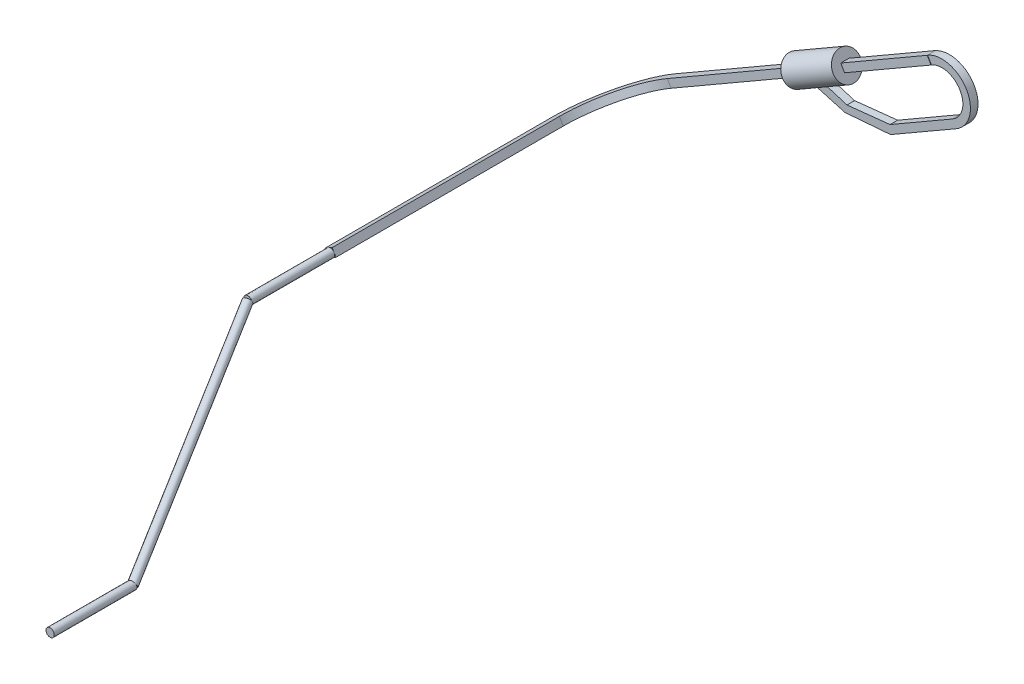
ISO-10303-21;
HEADER;
FILE_DESCRIPTION(('STEP AP214'),'2;1');
FILE_NAME('part.step','',(''),(''),'','','');
FILE_SCHEMA(('AUTOMOTIVE_DESIGN { 1 0 10303 214 1 1 1 1 }'));
ENDSEC;
DATA;
#1=APPLICATION_CONTEXT('core data for automotive mechanical design processes');
#2=APPLICATION_PROTOCOL_DEFINITION('international standard','automotive_design',2000,#1);
#3=PRODUCT_CONTEXT('',#1,'mechanical');
#4=PRODUCT('Part','Part','',(#3));
#5=PRODUCT_RELATED_PRODUCT_CATEGORY('part','',(#4));
#6=PRODUCT_DEFINITION_FORMATION('','',#4);
#7=PRODUCT_DEFINITION_CONTEXT('part definition',#1,'design');
#8=PRODUCT_DEFINITION('design','',#6,#7);
#9=PRODUCT_DEFINITION_SHAPE('','',#8);
#10=(LENGTH_UNIT() NAMED_UNIT(*) SI_UNIT(.MILLI.,.METRE.));
#11=(NAMED_UNIT(*) PLANE_ANGLE_UNIT() SI_UNIT($,.RADIAN.));
#12=(NAMED_UNIT(*) SI_UNIT($,.STERADIAN.) SOLID_ANGLE_UNIT());
#13=UNCERTAINTY_MEASURE_WITH_UNIT(LENGTH_MEASURE(1.E-05),#10,'distance_accuracy_value','');
#14=(GEOMETRIC_REPRESENTATION_CONTEXT(3) GLOBAL_UNCERTAINTY_ASSIGNED_CONTEXT((#13)) GLOBAL_UNIT_ASSIGNED_CONTEXT((#10,
#11,#12)) REPRESENTATION_CONTEXT('',''));
#15=CARTESIAN_POINT('',(0.,0.,0.));
#16=DIRECTION('',(0.,0.,1.));
#17=DIRECTION('',(1.,0.,0.));
#18=AXIS2_PLACEMENT_3D('',#15,#16,#17);
#19=CARTESIAN_POINT('',(8.06922863405995,34.0236860279186,-45.));
#20=DIRECTION('',(0.5,-0.866025403784439,0.));
#21=DIRECTION('',(0.866025403784439,0.5,0.));
#22=AXIS2_PLACEMENT_3D('',#19,#20,#21);
#23=PLANE('',#22);
#24=DIRECTION('',(0.866025403784439,0.5,0.));
#25=VECTOR('',#24,1.);
#26=CARTESIAN_POINT('',(8.06922863405995,34.0236860279186,-54.6));
#27=LINE('',#26,#25);
#28=CARTESIAN_POINT('',(8.06922863405995,34.0236860279186,-54.6));
#29=VERTEX_POINT('',#28);
#30=CARTESIAN_POINT('',(25.9080534025949,44.3229363100588,-54.6));
#31=VERTEX_POINT('',#30);
#32=EDGE_CURVE('E345',#29,#31,#27,.T.);
#33=ORIENTED_EDGE('',*,*,#32,.T.);
#34=DIRECTION('',(0.,0.,1.));
#35=VECTOR('',#34,1.);
#36=CARTESIAN_POINT('',(25.9080534025949,44.3229363100588,-45.));
#37=LINE('',#36,#35);
#38=CARTESIAN_POINT('',(25.9080534025949,44.3229363100588,-53.4));
#39=VERTEX_POINT('',#38);
#40=EDGE_CURVE('E63',#31,#39,#37,.T.);
#41=ORIENTED_EDGE('',*,*,#40,.T.);
#42=DIRECTION('',(-0.866025403784439,-0.5,0.));
#43=VECTOR('',#42,1.);
#44=CARTESIAN_POINT('',(45.826637689637,55.8229363100588,-53.4));
#45=LINE('',#44,#43);
#46=CARTESIAN_POINT('',(8.06922863405995,34.0236860279186,-53.4));
#47=VERTEX_POINT('',#46);
#48=EDGE_CURVE('E340',#39,#47,#45,.T.);
#49=ORIENTED_EDGE('',*,*,#48,.T.);
#50=CARTESIAN_POINT('',(8.06922863405995,34.0236860279186,-45.));
#51=DIRECTION('',(-0.5,0.866025403784439,0.));
#52=DIRECTION('',(-0.866025403784439,-0.5,0.));
#53=AXIS2_PLACEMENT_3D('',#50,#51,#52);
#54=CIRCLE('',#53,8.4);
#55=CARTESIAN_POINT('',(0.794615242270666,29.8236860279186,-45.));
#56=VERTEX_POINT('',#55);
#57=EDGE_CURVE('E335',#47,#56,#54,.T.);
#58=ORIENTED_EDGE('',*,*,#57,.T.);
#59=DIRECTION('',(0.,0.,1.));
#60=VECTOR('',#59,1.);
#61=CARTESIAN_POINT('',(0.794615242270663,29.8236860279186,-45.));
#62=LINE('',#61,#60);
#63=CARTESIAN_POINT('',(0.794615242270663,29.8236860279186,-12.));
#64=VERTEX_POINT('',#63);
#65=EDGE_CURVE('E329',#56,#64,#62,.T.);
#66=ORIENTED_EDGE('',*,*,#65,.T.);
#67=DIRECTION('',(-0.866025403784438,-0.500000000000001,0.));
#68=VECTOR('',#67,1.);
#69=CARTESIAN_POINT('',(0.794615242270663,29.8236860279186,-12.));
#70=LINE('',#69,#68);
#71=CARTESIAN_POINT('',(0.482665596572965,29.6435818160014,-12.));
#72=VERTEX_POINT('',#71);
#73=EDGE_CURVE('E349',#64,#72,#70,.T.);
#74=ORIENTED_EDGE('',*,*,#73,.T.);
#75=CARTESIAN_POINT('',(0.0673344034270324,29.4037902398357,-12.));
#76=VERTEX_POINT('',#75);
#77=EDGE_CURVE('E250',#72,#76,#70,.T.);
#78=ORIENTED_EDGE('',*,*,#77,.T.);
#79=CARTESIAN_POINT('',(-0.244615242270661,29.2236860279186,-12.));
#80=VERTEX_POINT('',#79);
#81=EDGE_CURVE('E313',#76,#80,#70,.T.);
#82=ORIENTED_EDGE('',*,*,#81,.T.);
#83=DIRECTION('',(0.,0.,-1.));
#84=VECTOR('',#83,1.);
#85=CARTESIAN_POINT('',(-0.244615242270661,29.2236860279186,-12.));
#86=LINE('',#85,#84);
#87=CARTESIAN_POINT('',(-0.244615242270661,29.2236860279186,-45.));
#88=VERTEX_POINT('',#87);
#89=EDGE_CURVE('E350',#80,#88,#86,.T.);
#90=ORIENTED_EDGE('',*,*,#89,.T.);
#91=CARTESIAN_POINT('',(8.06922863405995,34.0236860279186,-45.));
#92=DIRECTION('',(0.5,-0.866025403784439,0.));
#93=DIRECTION('',(0.866025403784439,0.5,0.));
#94=AXIS2_PLACEMENT_3D('',#91,#92,#93);
#95=CIRCLE('',#94,9.6);
#96=EDGE_CURVE('E344',#88,#29,#95,.T.);
#97=ORIENTED_EDGE('',*,*,#96,.T.);
#98=EDGE_LOOP('',(#33,#41,#49,#58,#66,#74,#78,#82,#90,#97));
#99=FACE_BOUND('',#98,.T.);
#100=ADVANCED_FACE('F39',(#99),#23,.T.);
#101=CARTESIAN_POINT('',(8.06922863405995,34.0236860279186,-54.6));
#102=DIRECTION('',(0.,0.,1.));
#103=DIRECTION('',(1.,0.,0.));
#104=AXIS2_PLACEMENT_3D('',#101,#102,#103);
#105=PLANE('',#104);
#106=DIRECTION('',(-0.5,0.866025403784439,0.));
#107=VECTOR('',#106,1.);
#108=CARTESIAN_POINT('',(25.9080534025949,44.3229363100588,-54.6));
#109=LINE('',#108,#107);
#110=CARTESIAN_POINT('',(25.3580534025949,45.2755642542217,-54.6));
#111=VERTEX_POINT('',#110);
#112=EDGE_CURVE('E53',#31,#111,#109,.T.);
#113=ORIENTED_EDGE('',*,*,#112,.F.);
#114=ORIENTED_EDGE('',*,*,#32,.F.);
#115=DIRECTION('',(-0.5,0.866025403784438,0.));
#116=VECTOR('',#115,1.);
#117=CARTESIAN_POINT('',(8.06922863405995,34.0236860279186,-54.6));
#118=LINE('',#117,#116);
#119=CARTESIAN_POINT('',(7.51922863405995,34.9763139720814,-54.6));
#120=VERTEX_POINT('',#119);
#121=EDGE_CURVE('E287',#29,#120,#118,.T.);
#122=ORIENTED_EDGE('',*,*,#121,.T.);
#123=DIRECTION('',(0.866025403784439,0.5,0.));
#124=VECTOR('',#123,1.);
#125=CARTESIAN_POINT('',(7.51922863405995,34.9763139720814,-54.6));
#126=LINE('',#125,#124);
#127=EDGE_CURVE('E325',#120,#111,#126,.T.);
#128=ORIENTED_EDGE('',*,*,#127,.T.);
#129=EDGE_LOOP('',(#113,#114,#122,#128));
#130=FACE_BOUND('',#129,.T.);
#131=ADVANCED_FACE('F457',(#130),#105,.F.);
#132=CARTESIAN_POINT('',(45.826637689637,55.8229363100588,-53.4));
#133=DIRECTION('',(0.,0.,-1.));
#134=DIRECTION('',(-1.,0.,0.));
#135=AXIS2_PLACEMENT_3D('',#132,#133,#134);
#136=PLANE('',#135);
#137=DIRECTION('',(0.5,-0.866025403784439,0.));
#138=VECTOR('',#137,1.);
#139=CARTESIAN_POINT('',(25.9080534025949,44.3229363100588,-53.4));
#140=LINE('',#139,#138);
#141=CARTESIAN_POINT('',(25.3580534025949,45.2755642542217,-53.4));
#142=VERTEX_POINT('',#141);
#143=EDGE_CURVE('E420',#142,#39,#140,.T.);
#144=ORIENTED_EDGE('',*,*,#143,.F.);
#145=DIRECTION('',(-0.866025403784439,-0.5,0.));
#146=VECTOR('',#145,1.);
#147=CARTESIAN_POINT('',(45.276637689637,56.7755642542217,-53.4));
#148=LINE('',#147,#146);
#149=CARTESIAN_POINT('',(7.51922863405995,34.9763139720814,-53.4));
#150=VERTEX_POINT('',#149);
#151=EDGE_CURVE('E320',#142,#150,#148,.T.);
#152=ORIENTED_EDGE('',*,*,#151,.T.);
#153=DIRECTION('',(-0.5,0.866025403784438,0.));
#154=VECTOR('',#153,1.);
#155=CARTESIAN_POINT('',(8.06922863405995,34.0236860279186,-53.4));
#156=LINE('',#155,#154);
#157=EDGE_CURVE('E296',#47,#150,#156,.T.);
#158=ORIENTED_EDGE('',*,*,#157,.F.);
#159=ORIENTED_EDGE('',*,*,#48,.F.);
#160=EDGE_LOOP('',(#144,#152,#158,#159));
#161=FACE_BOUND('',#160,.T.);
#162=ADVANCED_FACE('F461',(#161),#136,.F.);
#163=CARTESIAN_POINT('',(7.51922863405995,34.9763139720814,-45.));
#164=DIRECTION('',(0.5,-0.866025403784439,0.));
#165=DIRECTION('',(0.866025403784439,0.5,0.));
#166=AXIS2_PLACEMENT_3D('',#163,#164,#165);
#167=PLANE('',#166);
#168=DIRECTION('',(0.,0.,1.));
#169=VECTOR('',#168,1.);
#170=CARTESIAN_POINT('',(25.3580534025949,45.2755642542217,-45.));
#171=LINE('',#170,#169);
#172=EDGE_CURVE('E50',#111,#142,#171,.T.);
#173=ORIENTED_EDGE('',*,*,#172,.F.);
#174=ORIENTED_EDGE('',*,*,#127,.F.);
#175=CARTESIAN_POINT('',(7.51922863405995,34.9763139720814,-45.));
#176=DIRECTION('',(0.5,-0.866025403784439,0.));
#177=DIRECTION('',(0.866025403784439,0.5,0.));
#178=AXIS2_PLACEMENT_3D('',#175,#176,#177);
#179=CIRCLE('',#178,9.6);
#180=CARTESIAN_POINT('',(-0.794615242270661,30.1763139720814,-45.));
#181=VERTEX_POINT('',#180);
#182=EDGE_CURVE('E324',#181,#120,#179,.T.);
#183=ORIENTED_EDGE('',*,*,#182,.F.);
#184=DIRECTION('',(0.,0.,-1.));
#185=VECTOR('',#184,1.);
#186=CARTESIAN_POINT('',(-0.794615242270661,30.1763139720814,-12.));
#187=LINE('',#186,#185);
#188=CARTESIAN_POINT('',(-0.794615242270661,30.1763139720814,-12.));
#189=VERTEX_POINT('',#188);
#190=EDGE_CURVE('E330',#189,#181,#187,.T.);
#191=ORIENTED_EDGE('',*,*,#190,.F.);
#192=DIRECTION('',(-0.866025403784438,-0.500000000000001,0.));
#193=VECTOR('',#192,1.);
#194=CARTESIAN_POINT('',(0.244615242270663,30.7763139720814,-12.));
#195=LINE('',#194,#193);
#196=CARTESIAN_POINT('',(-0.482665596572942,30.3564181839986,-12.));
#197=VERTEX_POINT('',#196);
#198=EDGE_CURVE('E249',#197,#189,#195,.T.);
#199=ORIENTED_EDGE('',*,*,#198,.F.);
#200=CARTESIAN_POINT('',(-0.0673344034270613,30.5962097601643,-12.));
#201=VERTEX_POINT('',#200);
#202=EDGE_CURVE('E242',#201,#197,#195,.T.);
#203=ORIENTED_EDGE('',*,*,#202,.F.);
#204=CARTESIAN_POINT('',(0.244615242270663,30.7763139720814,-12.));
#205=VERTEX_POINT('',#204);
#206=EDGE_CURVE('E247',#205,#201,#195,.T.);
#207=ORIENTED_EDGE('',*,*,#206,.F.);
#208=DIRECTION('',(0.,0.,1.));
#209=VECTOR('',#208,1.);
#210=CARTESIAN_POINT('',(0.244615242270663,30.7763139720814,-45.));
#211=LINE('',#210,#209);
#212=CARTESIAN_POINT('',(0.244615242270665,30.7763139720814,-45.));
#213=VERTEX_POINT('',#212);
#214=EDGE_CURVE('E306',#213,#205,#211,.T.);
#215=ORIENTED_EDGE('',*,*,#214,.F.);
#216=CARTESIAN_POINT('',(7.51922863405995,34.9763139720814,-45.));
#217=DIRECTION('',(-0.5,0.866025403784439,0.));
#218=DIRECTION('',(-0.866025403784439,-0.5,0.));
#219=AXIS2_PLACEMENT_3D('',#216,#217,#218);
#220=CIRCLE('',#219,8.4);
#221=EDGE_CURVE('E315',#150,#213,#220,.T.);
#222=ORIENTED_EDGE('',*,*,#221,.F.);
#223=ORIENTED_EDGE('',*,*,#151,.F.);
#224=EDGE_LOOP('',(#173,#174,#183,#191,#199,#203,#207,#215,#222,#223));
#225=FACE_BOUND('',#224,.T.);
#226=ADVANCED_FACE('F587',(#225),#167,.F.);
#227=CARTESIAN_POINT('',(0.,30.,-12.));
#228=DIRECTION('',(0.,0.,1.));
#229=DIRECTION('',(1.,0.,0.));
#230=AXIS2_PLACEMENT_3D('',#227,#228,#229);
#231=PLANE('',#230);
#232=ORIENTED_EDGE('',*,*,#77,.F.);
#233=CARTESIAN_POINT('',(0.,30.,-12.));
#234=DIRECTION('',(0.,0.,1.));
#235=DIRECTION('',(1.,0.,0.));
#236=AXIS2_PLACEMENT_3D('',#233,#234,#235);
#237=CIRCLE('',#236,0.6);
#238=EDGE_CURVE('E693',#76,#72,#237,.T.);
#239=ORIENTED_EDGE('',*,*,#238,.F.);
#240=EDGE_LOOP('',(#232,#239));
#241=FACE_BOUND('',#240,.T.);
#242=ADVANCED_FACE('F594',(#241),#231,.F.);
#243=CARTESIAN_POINT('',(9.23492212988487,11.8201613041008,25.9598688092173));
#244=DIRECTION('',(-0.279755571140971,0.550725938572197,-0.78640813894527));
#245=DIRECTION('',(0.,0.81911434427579,0.573630273784118));
#246=AXIS2_PLACEMENT_3D('',#243,#244,#245);
#247=CYLINDRICAL_SURFACE('',#246,0.6);
#248=CARTESIAN_POINT('',(9.23492212988487,11.8201613041008,25.9598688092173));
#249=DIRECTION('',(0.279755571140971,-0.550725938572196,0.78640813894527));
#250=DIRECTION('',(0.,-0.81911434427579,-0.573630273784118));
#251=AXIS2_PLACEMENT_3D('',#248,#249,#250);
#252=CIRCLE('',#251,0.6);
#253=CARTESIAN_POINT('',(8.69998334378793,11.548425227863,25.9598688092173));
#254=VERTEX_POINT('',#253);
#255=CARTESIAN_POINT('',(9.76986091598182,12.0918973803387,25.9598688092173));
#256=VERTEX_POINT('',#255);
#257=EDGE_CURVE('E270',#254,#256,#252,.T.);
#258=ORIENTED_EDGE('',*,*,#257,.F.);
#259=CARTESIAN_POINT('',(9.23492212988487,11.8201613041008,25.9598688092173));
#260=DIRECTION('',(-0.148003982565759,0.29136017516476,-0.945094741003586));
#261=DIRECTION('',(0.428027227655543,-0.842613055831765,-0.326796466516034));
#262=AXIS2_PLACEMENT_3D('',#259,#260,#261);
#263=ELLIPSE('',#262,0.634856987314168,0.6);
#264=EDGE_CURVE('E265',#254,#256,#263,.T.);
#265=ORIENTED_EDGE('',*,*,#264,.T.);
#266=EDGE_LOOP('',(#258,#265));
#267=FACE_BOUND('',#266,.T.);
#268=CARTESIAN_POINT('',(0.,30.,0.));
#269=DIRECTION('',(-0.148003982565759,0.29136017516476,-0.945094741003586));
#270=DIRECTION('',(-0.428027227655543,0.842613055831765,0.326796466516034));
#271=AXIS2_PLACEMENT_3D('',#268,#269,#270);
#272=ELLIPSE('',#271,0.634856987314168,0.6);
#273=CARTESIAN_POINT('',(0.534938786096939,30.2717360762378,0.));
#274=VERTEX_POINT('',#273);
#275=CARTESIAN_POINT('',(-0.534938786096937,29.7282639237622,0.));
#276=VERTEX_POINT('',#275);
#277=EDGE_CURVE('E271',#274,#276,#272,.T.);
#278=ORIENTED_EDGE('',*,*,#277,.F.);
#279=CARTESIAN_POINT('',(0.,30.,0.));
#280=DIRECTION('',(0.279755571140971,-0.550725938572196,0.78640813894527));
#281=DIRECTION('',(0.,-0.81911434427579,-0.573630273784118));
#282=AXIS2_PLACEMENT_3D('',#279,#280,#281);
#283=CIRCLE('',#282,0.6);
#284=EDGE_CURVE('E268',#274,#276,#283,.T.);
#285=ORIENTED_EDGE('',*,*,#284,.T.);
#286=EDGE_LOOP('',(#278,#285));
#287=FACE_BOUND('',#286,.T.);
#288=ADVANCED_FACE('F715',(#267,#287),#247,.T.);
#289=CARTESIAN_POINT('',(9.23492212988488,11.8201613041008,37.9598688092173));
#290=DIRECTION('',(0.,0.,-1.));
#291=DIRECTION('',(-1.,0.,0.));
#292=AXIS2_PLACEMENT_3D('',#289,#290,#291);
#293=CYLINDRICAL_SURFACE('',#292,0.6);
#294=CARTESIAN_POINT('',(9.23492212988488,11.8201613041008,37.9598688092173));
#295=DIRECTION('',(0.,0.,1.));
#296=DIRECTION('',(1.,0.,0.));
#297=AXIS2_PLACEMENT_3D('',#294,#295,#296);
#298=CIRCLE('',#297,0.6);
#299=CARTESIAN_POINT('',(9.83492212988488,11.8201613041008,37.9598688092173));
#300=VERTEX_POINT('',#299);
#301=EDGE_CURVE('E256',#300,#300,#298,.T.);
#302=ORIENTED_EDGE('',*,*,#301,.F.);
#303=EDGE_LOOP('',(#302));
#304=FACE_BOUND('',#303,.T.);
#305=ORIENTED_EDGE('',*,*,#264,.F.);
#306=CARTESIAN_POINT('',(9.23492212988488,11.8201613041008,25.9598688092173));
#307=DIRECTION('',(0.,0.,1.));
#308=DIRECTION('',(1.,0.,0.));
#309=AXIS2_PLACEMENT_3D('',#306,#307,#308);
#310=CIRCLE('',#309,0.6);
#311=EDGE_CURVE('E259',#254,#256,#310,.T.);
#312=ORIENTED_EDGE('',*,*,#311,.T.);
#313=EDGE_LOOP('',(#305,#312));
#314=FACE_BOUND('',#313,.T.);
#315=ADVANCED_FACE('F41',(#304,#314),#293,.T.);
#316=CARTESIAN_POINT('',(9.23492212988488,11.8201613041008,37.9598688092173));
#317=DIRECTION('',(0.,0.,1.));
#318=DIRECTION('',(1.,0.,0.));
#319=AXIS2_PLACEMENT_3D('',#316,#317,#318);
#320=PLANE('',#319);
#321=ORIENTED_EDGE('',*,*,#301,.T.);
#322=EDGE_LOOP('',(#321));
#323=FACE_BOUND('',#322,.T.);
#324=ADVANCED_FACE('F861',(#323),#320,.T.);
#325=CARTESIAN_POINT('',(9.23492212988488,11.8201613041008,25.9598688092173));
#326=DIRECTION('',(0.,0.,1.));
#327=DIRECTION('',(1.,0.,0.));
#328=AXIS2_PLACEMENT_3D('',#325,#326,#327);
#329=PLANE('',#328);
#330=ORIENTED_EDGE('',*,*,#311,.F.);
#331=DIRECTION('',(0.891564643494898,0.452893460396389,0.));
#332=VECTOR('',#331,1.);
#333=CARTESIAN_POINT('',(9.23492212988488,11.8201613041008,25.9598688092173));
#334=LINE('',#333,#332);
#335=EDGE_CURVE('E254',#254,#256,#334,.T.);
#336=ORIENTED_EDGE('',*,*,#335,.T.);
#337=EDGE_LOOP('',(#330,#336));
#338=FACE_BOUND('',#337,.T.);
#339=ADVANCED_FACE('F852',(#338),#329,.F.);
#340=CARTESIAN_POINT('',(9.23492212988487,11.8201613041008,25.9598688092173));
#341=DIRECTION('',(0.279755571140971,-0.550725938572196,0.78640813894527));
#342=DIRECTION('',(0.,-0.81911434427579,-0.573630273784118));
#343=AXIS2_PLACEMENT_3D('',#340,#341,#342);
#344=PLANE('',#343);
#345=ORIENTED_EDGE('',*,*,#335,.F.);
#346=ORIENTED_EDGE('',*,*,#257,.T.);
#347=EDGE_LOOP('',(#345,#346));
#348=FACE_BOUND('',#347,.T.);
#349=ADVANCED_FACE('F848',(#348),#344,.T.);
#350=CARTESIAN_POINT('',(0.,30.,0.));
#351=DIRECTION('',(0.279755571140971,-0.550725938572196,0.78640813894527));
#352=DIRECTION('',(0.,-0.81911434427579,-0.573630273784118));
#353=AXIS2_PLACEMENT_3D('',#350,#351,#352);
#354=PLANE('',#353);
#355=ORIENTED_EDGE('',*,*,#284,.F.);
#356=DIRECTION('',(-0.891564643494898,-0.452893460396389,0.));
#357=VECTOR('',#356,1.);
#358=CARTESIAN_POINT('',(0.,30.,0.));
#359=LINE('',#358,#357);
#360=EDGE_CURVE('E252',#274,#276,#359,.T.);
#361=ORIENTED_EDGE('',*,*,#360,.T.);
#362=EDGE_LOOP('',(#355,#361));
#363=FACE_BOUND('',#362,.T.);
#364=ADVANCED_FACE('F835',(#363),#354,.F.);
#365=CARTESIAN_POINT('',(0.,30.,0.));
#366=DIRECTION('',(0.,0.,-1.));
#367=DIRECTION('',(-1.,0.,0.));
#368=AXIS2_PLACEMENT_3D('',#365,#366,#367);
#369=CYLINDRICAL_SURFACE('',#368,0.6);
#370=CARTESIAN_POINT('',(0.519615242270667,30.3,-12.));
#371=VERTEX_POINT('',#370);
#372=EDGE_CURVE('E277',#371,#201,#237,.T.);
#373=ORIENTED_EDGE('',*,*,#372,.T.);
#374=EDGE_CURVE('E276',#201,#197,#237,.T.);
#375=ORIENTED_EDGE('',*,*,#374,.T.);
#376=CARTESIAN_POINT('',(-0.519615242270658,29.7,-12.));
#377=VERTEX_POINT('',#376);
#378=EDGE_CURVE('E688',#197,#377,#237,.T.);
#379=ORIENTED_EDGE('',*,*,#378,.T.);
#380=EDGE_CURVE('E689',#377,#76,#237,.T.);
#381=ORIENTED_EDGE('',*,*,#380,.T.);
#382=ORIENTED_EDGE('',*,*,#238,.T.);
#383=EDGE_CURVE('E278',#72,#371,#237,.T.);
#384=ORIENTED_EDGE('',*,*,#383,.T.);
#385=EDGE_LOOP('',(#373,#375,#379,#381,#382,#384));
#386=FACE_BOUND('',#385,.T.);
#387=CARTESIAN_POINT('',(0.,30.,0.));
#388=DIRECTION('',(0.,0.,1.));
#389=DIRECTION('',(1.,0.,0.));
#390=AXIS2_PLACEMENT_3D('',#387,#388,#389);
#391=CIRCLE('',#390,0.6);
#392=EDGE_CURVE('E274',#274,#276,#391,.T.);
#393=ORIENTED_EDGE('',*,*,#392,.F.);
#394=ORIENTED_EDGE('',*,*,#277,.T.);
#395=EDGE_LOOP('',(#393,#394));
#396=FACE_BOUND('',#395,.T.);
#397=ADVANCED_FACE('F695',(#386,#396),#369,.T.);
#398=CARTESIAN_POINT('',(0.,30.,0.));
#399=DIRECTION('',(0.,0.,1.));
#400=DIRECTION('',(1.,0.,0.));
#401=AXIS2_PLACEMENT_3D('',#398,#399,#400);
#402=PLANE('',#401);
#403=ORIENTED_EDGE('',*,*,#360,.F.);
#404=ORIENTED_EDGE('',*,*,#392,.T.);
#405=EDGE_LOOP('',(#403,#404));
#406=FACE_BOUND('',#405,.T.);
#407=ADVANCED_FACE('F699',(#406),#402,.T.);
#408=ORIENTED_EDGE('',*,*,#374,.F.);
#409=ORIENTED_EDGE('',*,*,#202,.T.);
#410=EDGE_LOOP('',(#408,#409));
#411=FACE_BOUND('',#410,.T.);
#412=ADVANCED_FACE('F700',(#411),#231,.F.);
#413=CARTESIAN_POINT('',(0.794615242270663,29.8236860279186,-12.));
#414=DIRECTION('',(0.,0.,-1.));
#415=DIRECTION('',(-1.,0.,0.));
#416=AXIS2_PLACEMENT_3D('',#413,#414,#415);
#417=PLANE('',#416);
#418=ORIENTED_EDGE('',*,*,#378,.F.);
#419=ORIENTED_EDGE('',*,*,#198,.T.);
#420=DIRECTION('',(-0.5,0.866025403784438,0.));
#421=VECTOR('',#420,1.);
#422=CARTESIAN_POINT('',(-0.244615242270661,29.2236860279186,-12.));
#423=LINE('',#422,#421);
#424=EDGE_CURVE('E284',#377,#189,#423,.T.);
#425=ORIENTED_EDGE('',*,*,#424,.F.);
#426=EDGE_LOOP('',(#418,#419,#425));
#427=FACE_BOUND('',#426,.T.);
#428=ADVANCED_FACE('F684',(#427),#417,.F.);
#429=ORIENTED_EDGE('',*,*,#380,.F.);
#430=EDGE_CURVE('E285',#80,#377,#423,.T.);
#431=ORIENTED_EDGE('',*,*,#430,.F.);
#432=ORIENTED_EDGE('',*,*,#81,.F.);
#433=EDGE_LOOP('',(#429,#431,#432));
#434=FACE_BOUND('',#433,.T.);
#435=ADVANCED_FACE('F704',(#434),#417,.F.);
#436=ORIENTED_EDGE('',*,*,#372,.F.);
#437=DIRECTION('',(-0.5,0.866025403784438,0.));
#438=VECTOR('',#437,1.);
#439=CARTESIAN_POINT('',(0.794615242270663,29.8236860279186,-12.));
#440=LINE('',#439,#438);
#441=EDGE_CURVE('E307',#371,#205,#440,.T.);
#442=ORIENTED_EDGE('',*,*,#441,.T.);
#443=ORIENTED_EDGE('',*,*,#206,.T.);
#444=EDGE_LOOP('',(#436,#442,#443));
#445=FACE_BOUND('',#444,.T.);
#446=ADVANCED_FACE('F668',(#445),#417,.F.);
#447=ORIENTED_EDGE('',*,*,#383,.F.);
#448=ORIENTED_EDGE('',*,*,#73,.F.);
#449=EDGE_CURVE('E302',#64,#371,#440,.T.);
#450=ORIENTED_EDGE('',*,*,#449,.T.);
#451=EDGE_LOOP('',(#447,#448,#450));
#452=FACE_BOUND('',#451,.T.);
#453=ADVANCED_FACE('F669',(#452),#417,.F.);
#454=CARTESIAN_POINT('',(-0.244615242270661,29.2236860279186,-12.));
#455=DIRECTION('',(0.866025403784438,0.5,0.));
#456=DIRECTION('',(-0.5,0.866025403784439,0.));
#457=AXIS2_PLACEMENT_3D('',#454,#455,#456);
#458=PLANE('',#457);
#459=ORIENTED_EDGE('',*,*,#190,.T.);
#460=DIRECTION('',(-0.5,0.866025403784438,0.));
#461=VECTOR('',#460,1.);
#462=CARTESIAN_POINT('',(-0.244615242270661,29.2236860279186,-45.));
#463=LINE('',#462,#461);
#464=EDGE_CURVE('E288',#88,#181,#463,.T.);
#465=ORIENTED_EDGE('',*,*,#464,.F.);
#466=ORIENTED_EDGE('',*,*,#89,.F.);
#467=ORIENTED_EDGE('',*,*,#430,.T.);
#468=ORIENTED_EDGE('',*,*,#424,.T.);
#469=EDGE_LOOP('',(#459,#465,#466,#467,#468));
#470=FACE_BOUND('',#469,.T.);
#471=ADVANCED_FACE('F649',(#470),#458,.F.);
#472=CARTESIAN_POINT('',(8.06922863405995,34.0236860279186,-45.));
#473=DIRECTION('',(-0.5,0.866025403784438,0.));
#474=DIRECTION('',(-0.866025403784439,-0.5,0.));
#475=AXIS2_PLACEMENT_3D('',#472,#473,#474);
#476=CYLINDRICAL_SURFACE('',#475,9.6);
#477=ORIENTED_EDGE('',*,*,#182,.T.);
#478=ORIENTED_EDGE('',*,*,#121,.F.);
#479=ORIENTED_EDGE('',*,*,#96,.F.);
#480=ORIENTED_EDGE('',*,*,#464,.T.);
#481=EDGE_LOOP('',(#477,#478,#479,#480));
#482=FACE_BOUND('',#481,.T.);
#483=ADVANCED_FACE('F642',(#482),#476,.T.);
#484=CARTESIAN_POINT('',(8.06922863405995,34.0236860279186,-45.));
#485=DIRECTION('',(-0.5,0.866025403784438,0.));
#486=DIRECTION('',(-0.866025403784439,-0.5,0.));
#487=AXIS2_PLACEMENT_3D('',#484,#485,#486);
#488=CYLINDRICAL_SURFACE('',#487,8.4);
#489=ORIENTED_EDGE('',*,*,#221,.T.);
#490=DIRECTION('',(-0.5,0.866025403784438,0.));
#491=VECTOR('',#490,1.);
#492=CARTESIAN_POINT('',(0.794615242270666,29.8236860279186,-45.));
#493=LINE('',#492,#491);
#494=EDGE_CURVE('E303',#56,#213,#493,.T.);
#495=ORIENTED_EDGE('',*,*,#494,.F.);
#496=ORIENTED_EDGE('',*,*,#57,.F.);
#497=ORIENTED_EDGE('',*,*,#157,.T.);
#498=EDGE_LOOP('',(#489,#495,#496,#497));
#499=FACE_BOUND('',#498,.T.);
#500=ADVANCED_FACE('F645',(#499),#488,.F.);
#501=CARTESIAN_POINT('',(0.794615242270663,29.8236860279186,-45.));
#502=DIRECTION('',(-0.866025403784438,-0.5,0.));
#503=DIRECTION('',(0.5,-0.866025403784439,0.));
#504=AXIS2_PLACEMENT_3D('',#501,#502,#503);
#505=PLANE('',#504);
#506=ORIENTED_EDGE('',*,*,#214,.T.);
#507=ORIENTED_EDGE('',*,*,#441,.F.);
#508=ORIENTED_EDGE('',*,*,#449,.F.);
#509=ORIENTED_EDGE('',*,*,#65,.F.);
#510=ORIENTED_EDGE('',*,*,#494,.T.);
#511=EDGE_LOOP('',(#506,#507,#508,#509,#510));
#512=FACE_BOUND('',#511,.T.);
#513=ADVANCED_FACE('F434',(#512),#505,.F.);
#514=CARTESIAN_POINT('',(32.9942693347626,49.0492502821402,-54.));
#515=DIRECTION('',(-0.866025403784439,-0.5,0.));
#516=DIRECTION('',(0.5,-0.866025403784439,0.));
#517=AXIS2_PLACEMENT_3D('',#514,#515,#516);
#518=CYLINDRICAL_SURFACE('',#517,2.);
#519=CARTESIAN_POINT('',(32.9942693347626,49.0492502821402,-54.));
#520=DIRECTION('',(0.866025403784439,0.5,0.));
#521=DIRECTION('',(-0.5,0.866025403784439,0.));
#522=AXIS2_PLACEMENT_3D('',#519,#520,#521);
#523=CIRCLE('',#522,2.);
#524=CARTESIAN_POINT('',(31.9942693347626,50.7813010897091,-54.));
#525=VERTEX_POINT('',#524);
#526=EDGE_CURVE('E424',#525,#525,#523,.T.);
#527=ORIENTED_EDGE('',*,*,#526,.F.);
#528=EDGE_LOOP('',(#527));
#529=FACE_BOUND('',#528,.T.);
#530=CARTESIAN_POINT('',(25.6330534025949,44.7992502821402,-54.));
#531=DIRECTION('',(0.866025403784439,0.5,0.));
#532=DIRECTION('',(-0.5,0.866025403784439,0.));
#533=AXIS2_PLACEMENT_3D('',#530,#531,#532);
#534=CIRCLE('',#533,2.);
#535=CARTESIAN_POINT('',(24.6330534025949,46.5313010897091,-54.));
#536=VERTEX_POINT('',#535);
#537=EDGE_CURVE('E422',#536,#536,#534,.T.);
#538=ORIENTED_EDGE('',*,*,#537,.T.);
#539=EDGE_LOOP('',(#538));
#540=FACE_BOUND('',#539,.T.);
#541=DIRECTION('',(-0.866025403784439,-0.5,0.));
#542=VECTOR('',#541,1.);
#543=CARTESIAN_POINT('',(33.9557135609141,47.3839800338021,-53.45));
#544=LINE('',#543,#542);
#545=CARTESIAN_POINT('',(29.2752800707646,44.6817304983402,-53.45));
#546=VERTEX_POINT('',#545);
#547=CARTESIAN_POINT('',(30.7359950458765,45.5250746824303,-53.45));
#548=VERTEX_POINT('',#547);
#549=EDGE_CURVE('E232',#546,#548,#544,.F.);
#550=ORIENTED_EDGE('',*,*,#549,.T.);
#551=CARTESIAN_POINT('',(28.2311296139482,46.2992502821402,-54.));
#552=DIRECTION('',(-0.295286936198047,-0.955408616933493,0.));
#553=DIRECTION('',(-0.955408616933493,0.295286936198047,0.));
#554=AXIS2_PLACEMENT_3D('',#551,#552,#553);
#555=ELLIPSE('',#554,2.72691216768268,2.);
#556=CARTESIAN_POINT('',(30.7359950458765,45.5250746824303,-54.55));
#557=VERTEX_POINT('',#556);
#558=EDGE_CURVE('E239',#548,#557,#555,.F.);
#559=ORIENTED_EDGE('',*,*,#558,.T.);
#560=DIRECTION('',(-0.866025403784439,-0.5,0.));
#561=VECTOR('',#560,1.);
#562=CARTESIAN_POINT('',(33.9557135609141,47.3839800338021,-54.55));
#563=LINE('',#562,#561);
#564=CARTESIAN_POINT('',(29.2752800707646,44.6817304983402,-54.55));
#565=VERTEX_POINT('',#564);
#566=EDGE_CURVE('E238',#565,#557,#563,.F.);
#567=ORIENTED_EDGE('',*,*,#566,.F.);
#568=CARTESIAN_POINT('',(26.6891819437954,45.4090063797012,-54.));
#569=DIRECTION('',(0.270723424827322,0.962657170154446,0.));
#570=DIRECTION('',(-0.962657170154446,0.270723424827322,0.));
#571=AXIS2_PLACEMENT_3D('',#568,#569,#570);
#572=ELLIPSE('',#571,2.79414702275506,2.);
#573=EDGE_CURVE('E224',#565,#546,#572,.F.);
#574=ORIENTED_EDGE('',*,*,#573,.T.);
#575=EDGE_LOOP('',(#550,#559,#567,#574));
#576=FACE_BOUND('',#575,.T.);
#577=ADVANCED_FACE('F241',(#529,#540,#576),#518,.T.);
#578=CARTESIAN_POINT('',(32.9942693347626,49.0492502821402,-54.));
#579=DIRECTION('',(0.866025403784439,0.5,0.));
#580=DIRECTION('',(-0.5,0.866025403784439,0.));
#581=AXIS2_PLACEMENT_3D('',#578,#579,#580);
#582=PLANE('',#581);
#583=DIRECTION('',(-0.5,0.866025403784439,0.));
#584=VECTOR('',#583,1.);
#585=CARTESIAN_POINT('',(33.2692693347626,48.5729363100588,-54.6));
#586=LINE('',#585,#584);
#587=CARTESIAN_POINT('',(33.2692693347626,48.5729363100588,-54.6));
#588=VERTEX_POINT('',#587);
#589=CARTESIAN_POINT('',(32.7192693347626,49.5255642542217,-54.6));
#590=VERTEX_POINT('',#589);
#591=EDGE_CURVE('E413',#588,#590,#586,.T.);
#592=ORIENTED_EDGE('',*,*,#591,.F.);
#593=DIRECTION('',(0.,0.,1.));
#594=VECTOR('',#593,1.);
#595=CARTESIAN_POINT('',(33.2692693347626,48.5729363100588,-45.));
#596=LINE('',#595,#594);
#597=CARTESIAN_POINT('',(33.2692693347626,48.5729363100588,-53.4));
#598=VERTEX_POINT('',#597);
#599=EDGE_CURVE('E397',#588,#598,#596,.T.);
#600=ORIENTED_EDGE('',*,*,#599,.T.);
#601=DIRECTION('',(0.5,-0.866025403784439,0.));
#602=VECTOR('',#601,1.);
#603=CARTESIAN_POINT('',(33.2692693347626,48.5729363100588,-53.4));
#604=LINE('',#603,#602);
#605=CARTESIAN_POINT('',(32.7192693347626,49.5255642542217,-53.4));
#606=VERTEX_POINT('',#605);
#607=EDGE_CURVE('E412',#606,#598,#604,.T.);
#608=ORIENTED_EDGE('',*,*,#607,.F.);
#609=DIRECTION('',(0.,0.,1.));
#610=VECTOR('',#609,1.);
#611=CARTESIAN_POINT('',(32.7192693347626,49.5255642542217,-45.));
#612=LINE('',#611,#610);
#613=EDGE_CURVE('E11',#590,#606,#612,.T.);
#614=ORIENTED_EDGE('',*,*,#613,.F.);
#615=EDGE_LOOP('',(#592,#600,#608,#614));
#616=FACE_BOUND('',#615,.T.);
#617=ORIENTED_EDGE('',*,*,#526,.T.);
#618=EDGE_LOOP('',(#617));
#619=FACE_BOUND('',#618,.T.);
#620=ADVANCED_FACE('F431',(#616,#619),#582,.T.);
#621=CARTESIAN_POINT('',(25.6330534025949,44.7992502821402,-54.));
#622=DIRECTION('',(0.866025403784439,0.5,0.));
#623=DIRECTION('',(-0.5,0.866025403784439,0.));
#624=AXIS2_PLACEMENT_3D('',#621,#622,#623);
#625=PLANE('',#624);
#626=ORIENTED_EDGE('',*,*,#40,.F.);
#627=ORIENTED_EDGE('',*,*,#112,.T.);
#628=ORIENTED_EDGE('',*,*,#172,.T.);
#629=ORIENTED_EDGE('',*,*,#143,.T.);
#630=EDGE_LOOP('',(#626,#627,#628,#629));
#631=FACE_BOUND('',#630,.T.);
#632=ORIENTED_EDGE('',*,*,#537,.F.);
#633=EDGE_LOOP('',(#632));
#634=FACE_BOUND('',#633,.T.);
#635=ADVANCED_FACE('F438',(#631,#634),#625,.F.);
#636=CARTESIAN_POINT('',(45.826637689637,55.8229363100588,-54.6));
#637=DIRECTION('',(-0.866025403784438,-0.5,0.));
#638=DIRECTION('',(0.5,-0.866025403784439,0.));
#639=AXIS2_PLACEMENT_3D('',#636,#637,#638);
#640=PLANE('',#639);
#641=DIRECTION('',(0.5,-0.866025403784439,0.));
#642=VECTOR('',#641,1.);
#643=CARTESIAN_POINT('',(45.826637689637,55.8229363100588,-53.45));
#644=LINE('',#643,#642);
#645=CARTESIAN_POINT('',(45.276637689637,56.7755642542217,-53.45));
#646=VERTEX_POINT('',#645);
#647=CARTESIAN_POINT('',(45.826637689637,55.8229363100588,-53.45));
#648=VERTEX_POINT('',#647);
#649=EDGE_CURVE('E355',#646,#648,#644,.T.);
#650=ORIENTED_EDGE('',*,*,#649,.F.);
#651=DIRECTION('',(0.,0.,1.));
#652=VECTOR('',#651,1.);
#653=CARTESIAN_POINT('',(45.276637689637,56.7755642542217,-54.6));
#654=LINE('',#653,#652);
#655=CARTESIAN_POINT('',(45.276637689637,56.7755642542217,-53.4));
#656=VERTEX_POINT('',#655);
#657=EDGE_CURVE('E321',#646,#656,#654,.T.);
#658=ORIENTED_EDGE('',*,*,#657,.T.);
#659=DIRECTION('',(-0.5,0.866025403784438,0.));
#660=VECTOR('',#659,1.);
#661=CARTESIAN_POINT('',(45.826637689637,55.8229363100588,-53.4));
#662=LINE('',#661,#660);
#663=CARTESIAN_POINT('',(45.826637689637,55.8229363100588,-53.4));
#664=VERTEX_POINT('',#663);
#665=EDGE_CURVE('E293',#664,#656,#662,.T.);
#666=ORIENTED_EDGE('',*,*,#665,.F.);
#667=DIRECTION('',(0.,0.,1.));
#668=VECTOR('',#667,1.);
#669=CARTESIAN_POINT('',(45.826637689637,55.8229363100588,-54.6));
#670=LINE('',#669,#668);
#671=EDGE_CURVE('E343',#648,#664,#670,.T.);
#672=ORIENTED_EDGE('',*,*,#671,.F.);
#673=EDGE_LOOP('',(#650,#658,#666,#672));
#674=FACE_BOUND('',#673,.T.);
#675=ADVANCED_FACE('F442',(#674),#640,.F.);
#676=CARTESIAN_POINT('',(49.426637689637,49.5875534028108,-53.45));
#677=DIRECTION('',(-0.5,0.866025403784439,0.));
#678=DIRECTION('',(-0.866025403784439,-0.5,0.));
#679=AXIS2_PLACEMENT_3D('',#676,#677,#678);
#680=PLANE('',#679);
#681=DIRECTION('',(0.866025403784439,0.5,0.));
#682=VECTOR('',#681,1.);
#683=CARTESIAN_POINT('',(49.426637689637,49.5875534028108,-54.55));
#684=LINE('',#683,#682);
#685=CARTESIAN_POINT('',(39.9003582480082,44.0875534028108,-54.55));
#686=VERTEX_POINT('',#685);
#687=CARTESIAN_POINT('',(49.426637689637,49.5875534028108,-54.55));
#688=VERTEX_POINT('',#687);
#689=EDGE_CURVE('E383',#686,#688,#684,.T.);
#690=ORIENTED_EDGE('',*,*,#689,.T.);
#691=DIRECTION('',(0.,0.,-1.));
#692=VECTOR('',#691,1.);
#693=CARTESIAN_POINT('',(49.426637689637,49.5875534028108,-53.45));
#694=LINE('',#693,#692);
#695=CARTESIAN_POINT('',(49.426637689637,49.5875534028108,-53.45));
#696=VERTEX_POINT('',#695);
#697=EDGE_CURVE('E373',#696,#688,#694,.T.);
#698=ORIENTED_EDGE('',*,*,#697,.F.);
#699=DIRECTION('',(0.866025403784439,0.5,0.));
#700=VECTOR('',#699,1.);
#701=CARTESIAN_POINT('',(49.426637689637,49.5875534028108,-53.45));
#702=LINE('',#701,#700);
#703=CARTESIAN_POINT('',(39.9003582480082,44.0875534028108,-53.45));
#704=VERTEX_POINT('',#703);
#705=EDGE_CURVE('E402',#704,#696,#702,.T.);
#706=ORIENTED_EDGE('',*,*,#705,.F.);
#707=DIRECTION('',(0.,0.,-1.));
#708=VECTOR('',#707,1.);
#709=CARTESIAN_POINT('',(39.9003582480082,44.0875534028108,-53.45));
#710=LINE('',#709,#708);
#711=EDGE_CURVE('E367',#704,#686,#710,.T.);
#712=ORIENTED_EDGE('',*,*,#711,.T.);
#713=EDGE_LOOP('',(#690,#698,#706,#712));
#714=FACE_BOUND('',#713,.T.);
#715=ADVANCED_FACE('F447',(#714),#680,.F.);
#716=CARTESIAN_POINT('',(47.351637689637,53.1815588285162,-53.45));
#717=DIRECTION('',(0.,0.,-1.));
#718=DIRECTION('',(-1.,0.,0.));
#719=AXIS2_PLACEMENT_3D('',#716,#717,#718);
#720=CYLINDRICAL_SURFACE('',#719,4.15);
#721=CARTESIAN_POINT('',(47.351637689637,53.1815588285162,-54.55));
#722=DIRECTION('',(0.,0.,1.));
#723=DIRECTION('',(-1.,0.,0.));
#724=AXIS2_PLACEMENT_3D('',#721,#722,#723);
#725=CIRCLE('',#724,4.15);
#726=CARTESIAN_POINT('',(45.276637689637,56.7755642542217,-54.55));
#727=VERTEX_POINT('',#726);
#728=EDGE_CURVE('E379',#688,#727,#725,.T.);
#729=ORIENTED_EDGE('',*,*,#728,.T.);
#730=DIRECTION('',(0.,0.,-1.));
#731=VECTOR('',#730,1.);
#732=CARTESIAN_POINT('',(45.276637689637,56.7755642542217,-53.45));
#733=LINE('',#732,#731);
#734=EDGE_CURVE('E376',#646,#727,#733,.T.);
#735=ORIENTED_EDGE('',*,*,#734,.F.);
#736=CARTESIAN_POINT('',(47.351637689637,53.1815588285162,-53.45));
#737=DIRECTION('',(0.,0.,1.));
#738=DIRECTION('',(-1.,0.,0.));
#739=AXIS2_PLACEMENT_3D('',#736,#737,#738);
#740=CIRCLE('',#739,4.15);
#741=EDGE_CURVE('E377',#696,#646,#740,.T.);
#742=ORIENTED_EDGE('',*,*,#741,.F.);
#743=ORIENTED_EDGE('',*,*,#697,.T.);
#744=EDGE_LOOP('',(#729,#735,#742,#743));
#745=FACE_BOUND('',#744,.T.);
#746=ADVANCED_FACE('F501',(#745),#720,.T.);
#747=CARTESIAN_POINT('',(45.276637689637,56.7755642542217,-54.6));
#748=VERTEX_POINT('',#747);
#749=EDGE_CURVE('E318',#748,#727,#654,.T.);
#750=ORIENTED_EDGE('',*,*,#749,.T.);
#751=DIRECTION('',(0.5,-0.866025403784439,0.));
#752=VECTOR('',#751,1.);
#753=CARTESIAN_POINT('',(45.826637689637,55.8229363100588,-54.55));
#754=LINE('',#753,#752);
#755=CARTESIAN_POINT('',(45.826637689637,55.8229363100588,-54.55));
#756=VERTEX_POINT('',#755);
#757=EDGE_CURVE('E352',#727,#756,#754,.T.);
#758=ORIENTED_EDGE('',*,*,#757,.T.);
#759=CARTESIAN_POINT('',(45.826637689637,55.8229363100588,-54.6));
#760=VERTEX_POINT('',#759);
#761=EDGE_CURVE('E336',#760,#756,#670,.T.);
#762=ORIENTED_EDGE('',*,*,#761,.F.);
#763=DIRECTION('',(-0.5,0.866025403784438,0.));
#764=VECTOR('',#763,1.);
#765=CARTESIAN_POINT('',(45.826637689637,55.8229363100588,-54.6));
#766=LINE('',#765,#764);
#767=EDGE_CURVE('E295',#760,#748,#766,.T.);
#768=ORIENTED_EDGE('',*,*,#767,.T.);
#769=EDGE_LOOP('',(#750,#758,#762,#768));
#770=FACE_BOUND('',#769,.T.);
#771=ADVANCED_FACE('F455',(#770),#640,.F.);
#772=EDGE_CURVE('E322',#590,#748,#126,.T.);
#773=ORIENTED_EDGE('',*,*,#772,.F.);
#774=ORIENTED_EDGE('',*,*,#613,.T.);
#775=EDGE_CURVE('E314',#656,#606,#148,.T.);
#776=ORIENTED_EDGE('',*,*,#775,.F.);
#777=ORIENTED_EDGE('',*,*,#657,.F.);
#778=ORIENTED_EDGE('',*,*,#734,.T.);
#779=ORIENTED_EDGE('',*,*,#749,.F.);
#780=EDGE_LOOP('',(#773,#774,#776,#777,#778,#779));
#781=FACE_BOUND('',#780,.T.);
#782=ADVANCED_FACE('F496',(#781),#167,.F.);
#783=ORIENTED_EDGE('',*,*,#775,.T.);
#784=ORIENTED_EDGE('',*,*,#607,.T.);
#785=EDGE_CURVE('E331',#664,#598,#45,.T.);
#786=ORIENTED_EDGE('',*,*,#785,.F.);
#787=ORIENTED_EDGE('',*,*,#665,.T.);
#788=EDGE_LOOP('',(#783,#784,#786,#787));
#789=FACE_BOUND('',#788,.T.);
#790=ADVANCED_FACE('F476',(#789),#136,.F.);
#791=EDGE_CURVE('E342',#588,#760,#27,.T.);
#792=ORIENTED_EDGE('',*,*,#791,.F.);
#793=ORIENTED_EDGE('',*,*,#591,.T.);
#794=ORIENTED_EDGE('',*,*,#772,.T.);
#795=ORIENTED_EDGE('',*,*,#767,.F.);
#796=EDGE_LOOP('',(#792,#793,#794,#795));
#797=FACE_BOUND('',#796,.T.);
#798=ADVANCED_FACE('F464',(#797),#105,.F.);
#799=ORIENTED_EDGE('',*,*,#599,.F.);
#800=ORIENTED_EDGE('',*,*,#791,.T.);
#801=ORIENTED_EDGE('',*,*,#761,.T.);
#802=DIRECTION('',(0.,0.,-1.));
#803=VECTOR('',#802,1.);
#804=CARTESIAN_POINT('',(45.826637689637,55.8229363100588,-53.45));
#805=LINE('',#804,#803);
#806=EDGE_CURVE('E360',#648,#756,#805,.T.);
#807=ORIENTED_EDGE('',*,*,#806,.F.);
#808=ORIENTED_EDGE('',*,*,#671,.T.);
#809=ORIENTED_EDGE('',*,*,#785,.T.);
#810=EDGE_LOOP('',(#799,#800,#801,#807,#808,#809));
#811=FACE_BOUND('',#810,.T.);
#812=ADVANCED_FACE('F456',(#811),#23,.T.);
#813=CARTESIAN_POINT('',(47.351637689637,53.1815588285162,-53.45));
#814=DIRECTION('',(0.,0.,-1.));
#815=DIRECTION('',(-1.,0.,0.));
#816=AXIS2_PLACEMENT_3D('',#813,#814,#815);
#817=CYLINDRICAL_SURFACE('',#816,3.05);
#818=CARTESIAN_POINT('',(47.351637689637,53.1815588285162,-54.55));
#819=DIRECTION('',(0.,0.,-1.));
#820=DIRECTION('',(1.,0.,0.));
#821=AXIS2_PLACEMENT_3D('',#818,#819,#820);
#822=CIRCLE('',#821,3.05);
#823=CARTESIAN_POINT('',(48.876637689637,50.5401813469737,-54.55));
#824=VERTEX_POINT('',#823);
#825=EDGE_CURVE('E400',#756,#824,#822,.T.);
#826=ORIENTED_EDGE('',*,*,#825,.T.);
#827=DIRECTION('',(0.,0.,-1.));
#828=VECTOR('',#827,1.);
#829=CARTESIAN_POINT('',(48.876637689637,50.5401813469737,-53.45));
#830=LINE('',#829,#828);
#831=CARTESIAN_POINT('',(48.876637689637,50.5401813469737,-53.45));
#832=VERTEX_POINT('',#831);
#833=EDGE_CURVE('E359',#832,#824,#830,.T.);
#834=ORIENTED_EDGE('',*,*,#833,.F.);
#835=CARTESIAN_POINT('',(47.351637689637,53.1815588285162,-53.45));
#836=DIRECTION('',(0.,0.,-1.));
#837=DIRECTION('',(1.,0.,0.));
#838=AXIS2_PLACEMENT_3D('',#835,#836,#837);
#839=CIRCLE('',#838,3.05);
#840=EDGE_CURVE('E382',#648,#832,#839,.T.);
#841=ORIENTED_EDGE('',*,*,#840,.F.);
#842=ORIENTED_EDGE('',*,*,#806,.T.);
#843=EDGE_LOOP('',(#826,#834,#841,#842));
#844=FACE_BOUND('',#843,.T.);
#845=ADVANCED_FACE('F467',(#844),#817,.F.);
#846=CARTESIAN_POINT('',(39.8266722200896,45.3151813469737,-53.45));
#847=DIRECTION('',(0.500000000000001,-0.866025403784438,0.));
#848=DIRECTION('',(0.866025403784438,0.500000000000001,0.));
#849=AXIS2_PLACEMENT_3D('',#846,#847,#848);
#850=PLANE('',#849);
#851=DIRECTION('',(-0.866025403784438,-0.500000000000001,0.));
#852=VECTOR('',#851,1.);
#853=CARTESIAN_POINT('',(39.8266722200896,45.3151813469737,-54.55));
#854=LINE('',#853,#852);
#855=CARTESIAN_POINT('',(39.8266722200896,45.3151813469737,-54.55));
#856=VERTEX_POINT('',#855);
#857=EDGE_CURVE('E394',#824,#856,#854,.T.);
#858=ORIENTED_EDGE('',*,*,#857,.T.);
#859=DIRECTION('',(0.,0.,-1.));
#860=VECTOR('',#859,1.);
#861=CARTESIAN_POINT('',(39.8266722200896,45.3151813469737,-53.45));
#862=LINE('',#861,#860);
#863=CARTESIAN_POINT('',(39.8266722200896,45.3151813469737,-53.45));
#864=VERTEX_POINT('',#863);
#865=EDGE_CURVE('E361',#864,#856,#862,.T.);
#866=ORIENTED_EDGE('',*,*,#865,.F.);
#867=DIRECTION('',(-0.866025403784438,-0.500000000000001,0.));
#868=VECTOR('',#867,1.);
#869=CARTESIAN_POINT('',(39.8266722200896,45.3151813469737,-53.45));
#870=LINE('',#869,#868);
#871=EDGE_CURVE('E410',#832,#864,#870,.T.);
#872=ORIENTED_EDGE('',*,*,#871,.F.);
#873=ORIENTED_EDGE('',*,*,#833,.T.);
#874=EDGE_LOOP('',(#858,#866,#872,#873));
#875=FACE_BOUND('',#874,.T.);
#876=ADVANCED_FACE('F478',(#875),#850,.F.);
#877=CARTESIAN_POINT('',(33.5720261483291,44.648546126624,-53.45));
#878=DIRECTION('',(0.105982136439582,-0.99436803385653,0.));
#879=DIRECTION('',(0.99436803385653,0.105982136439582,0.));
#880=AXIS2_PLACEMENT_3D('',#877,#878,#879);
#881=PLANE('',#880);
#882=DIRECTION('',(-0.99436803385653,-0.105982136439582,0.));
#883=VECTOR('',#882,1.);
#884=CARTESIAN_POINT('',(33.5720261483291,44.648546126624,-54.55));
#885=LINE('',#884,#883);
#886=CARTESIAN_POINT('',(33.5720261483291,44.648546126624,-54.55));
#887=VERTEX_POINT('',#886);
#888=EDGE_CURVE('E391',#856,#887,#885,.T.);
#889=ORIENTED_EDGE('',*,*,#888,.T.);
#890=DIRECTION('',(0.,0.,-1.));
#891=VECTOR('',#890,1.);
#892=CARTESIAN_POINT('',(33.5720261483291,44.648546126624,-53.45));
#893=LINE('',#892,#891);
#894=CARTESIAN_POINT('',(33.5720261483291,44.648546126624,-53.45));
#895=VERTEX_POINT('',#894);
#896=EDGE_CURVE('E368',#895,#887,#893,.T.);
#897=ORIENTED_EDGE('',*,*,#896,.F.);
#898=DIRECTION('',(-0.99436803385653,-0.105982136439582,0.));
#899=VECTOR('',#898,1.);
#900=CARTESIAN_POINT('',(33.5720261483291,44.648546126624,-53.45));
#901=LINE('',#900,#899);
#902=EDGE_CURVE('E403',#864,#895,#901,.T.);
#903=ORIENTED_EDGE('',*,*,#902,.F.);
#904=ORIENTED_EDGE('',*,*,#865,.T.);
#905=EDGE_LOOP('',(#889,#897,#903,#904));
#906=FACE_BOUND('',#905,.T.);
#907=ADVANCED_FACE('F520',(#906),#881,.F.);
#908=CARTESIAN_POINT('',(39.9003582480082,44.0875534028108,-53.45));
#909=DIRECTION('',(-0.0800646510941786,0.996789672721968,0.));
#910=DIRECTION('',(-0.996789672721968,-0.0800646510941787,0.));
#911=AXIS2_PLACEMENT_3D('',#908,#909,#910);
#912=PLANE('',#911);
#913=DIRECTION('',(0.996789672721968,0.0800646510941786,0.));
#914=VECTOR('',#913,1.);
#915=CARTESIAN_POINT('',(39.9003582480082,44.0875534028108,-54.55));
#916=LINE('',#915,#914);
#917=CARTESIAN_POINT('',(33.2792058253015,43.5557258035965,-54.55));
#918=VERTEX_POINT('',#917);
#919=EDGE_CURVE('E387',#918,#686,#916,.T.);
#920=ORIENTED_EDGE('',*,*,#919,.T.);
#921=ORIENTED_EDGE('',*,*,#711,.F.);
#922=DIRECTION('',(0.996789672721968,0.0800646510941786,0.));
#923=VECTOR('',#922,1.);
#924=CARTESIAN_POINT('',(39.9003582480082,44.0875534028108,-53.45));
#925=LINE('',#924,#923);
#926=CARTESIAN_POINT('',(33.2792058253015,43.5557258035965,-53.45));
#927=VERTEX_POINT('',#926);
#928=EDGE_CURVE('E227',#927,#704,#925,.T.);
#929=ORIENTED_EDGE('',*,*,#928,.F.);
#930=DIRECTION('',(0.,0.,-1.));
#931=VECTOR('',#930,1.);
#932=CARTESIAN_POINT('',(33.2792058253015,43.5557258035965,-53.45));
#933=LINE('',#932,#931);
#934=EDGE_CURVE('E228',#927,#918,#933,.T.);
#935=ORIENTED_EDGE('',*,*,#934,.T.);
#936=EDGE_LOOP('',(#920,#921,#929,#935));
#937=FACE_BOUND('',#936,.T.);
#938=ADVANCED_FACE('F525',(#937),#912,.F.);
#939=CARTESIAN_POINT('',(28.2311296139482,46.2992502821402,-53.45));
#940=DIRECTION('',(-0.295286936198047,-0.955408616933493,0.));
#941=DIRECTION('',(0.955408616933493,-0.295286936198047,0.));
#942=AXIS2_PLACEMENT_3D('',#939,#940,#941);
#943=PLANE('',#942);
#944=ORIENTED_EDGE('',*,*,#558,.F.);
#945=DIRECTION('',(-0.955408616933493,0.295286936198047,0.));
#946=VECTOR('',#945,1.);
#947=CARTESIAN_POINT('',(28.2311296139482,46.2992502821402,-53.45));
#948=LINE('',#947,#946);
#949=EDGE_CURVE('E229',#895,#548,#948,.T.);
#950=ORIENTED_EDGE('',*,*,#949,.F.);
#951=ORIENTED_EDGE('',*,*,#896,.T.);
#952=DIRECTION('',(-0.955408616933493,0.295286936198047,0.));
#953=VECTOR('',#952,1.);
#954=CARTESIAN_POINT('',(28.2311296139482,46.2992502821402,-54.55));
#955=LINE('',#954,#953);
#956=EDGE_CURVE('E388',#887,#557,#955,.T.);
#957=ORIENTED_EDGE('',*,*,#956,.T.);
#958=EDGE_LOOP('',(#944,#950,#951,#957));
#959=FACE_BOUND('',#958,.T.);
#960=ADVANCED_FACE('F519',(#959),#943,.F.);
#961=CARTESIAN_POINT('',(33.2792058253015,43.5557258035965,-53.45));
#962=DIRECTION('',(0.270723424827322,0.962657170154446,0.));
#963=DIRECTION('',(-0.962657170154446,0.270723424827322,0.));
#964=AXIS2_PLACEMENT_3D('',#961,#962,#963);
#965=PLANE('',#964);
#966=ORIENTED_EDGE('',*,*,#573,.F.);
#967=DIRECTION('',(0.962657170154446,-0.270723424827322,0.));
#968=VECTOR('',#967,1.);
#969=CARTESIAN_POINT('',(33.2792058253015,43.5557258035965,-54.55));
#970=LINE('',#969,#968);
#971=EDGE_CURVE('E389',#565,#918,#970,.T.);
#972=ORIENTED_EDGE('',*,*,#971,.T.);
#973=ORIENTED_EDGE('',*,*,#934,.F.);
#974=DIRECTION('',(0.962657170154446,-0.270723424827322,0.));
#975=VECTOR('',#974,1.);
#976=CARTESIAN_POINT('',(33.2792058253015,43.5557258035965,-53.45));
#977=LINE('',#976,#975);
#978=EDGE_CURVE('E218',#546,#927,#977,.T.);
#979=ORIENTED_EDGE('',*,*,#978,.F.);
#980=EDGE_LOOP('',(#966,#972,#973,#979));
#981=FACE_BOUND('',#980,.T.);
#982=ADVANCED_FACE('F222',(#981),#965,.F.);
#983=CARTESIAN_POINT('',(47.351637689637,53.1815588285162,-54.55));
#984=DIRECTION('',(0.,0.,-1.));
#985=DIRECTION('',(-1.,0.,0.));
#986=AXIS2_PLACEMENT_3D('',#983,#984,#985);
#987=PLANE('',#986);
#988=ORIENTED_EDGE('',*,*,#971,.F.);
#989=ORIENTED_EDGE('',*,*,#566,.T.);
#990=ORIENTED_EDGE('',*,*,#956,.F.);
#991=ORIENTED_EDGE('',*,*,#888,.F.);
#992=ORIENTED_EDGE('',*,*,#857,.F.);
#993=ORIENTED_EDGE('',*,*,#825,.F.);
#994=ORIENTED_EDGE('',*,*,#757,.F.);
#995=ORIENTED_EDGE('',*,*,#728,.F.);
#996=ORIENTED_EDGE('',*,*,#689,.F.);
#997=ORIENTED_EDGE('',*,*,#919,.F.);
#998=EDGE_LOOP('',(#988,#989,#990,#991,#992,#993,#994,#995,#996,#997));
#999=FACE_BOUND('',#998,.T.);
#1000=ADVANCED_FACE('F506',(#999),#987,.T.);
#1001=CARTESIAN_POINT('',(47.351637689637,53.1815588285162,-53.45));
#1002=DIRECTION('',(0.,0.,-1.));
#1003=DIRECTION('',(-1.,0.,0.));
#1004=AXIS2_PLACEMENT_3D('',#1001,#1002,#1003);
#1005=PLANE('',#1004);
#1006=ORIENTED_EDGE('',*,*,#549,.F.);
#1007=ORIENTED_EDGE('',*,*,#978,.T.);
#1008=ORIENTED_EDGE('',*,*,#928,.T.);
#1009=ORIENTED_EDGE('',*,*,#705,.T.);
#1010=ORIENTED_EDGE('',*,*,#741,.T.);
#1011=ORIENTED_EDGE('',*,*,#649,.T.);
#1012=ORIENTED_EDGE('',*,*,#840,.T.);
#1013=ORIENTED_EDGE('',*,*,#871,.T.);
#1014=ORIENTED_EDGE('',*,*,#902,.T.);
#1015=ORIENTED_EDGE('',*,*,#949,.T.);
#1016=EDGE_LOOP('',(#1006,#1007,#1008,#1009,#1010,#1011,#1012,#1013,#1014,#1015));
#1017=FACE_BOUND('',#1016,.T.);
#1018=ADVANCED_FACE('F234',(#1017),#1005,.F.);
#1019=CLOSED_SHELL('',(#100,#131,#162,#226,#242,#288,#315,#324,#339,#349,#364,#397,#407,#412,
#428,#435,#446,#453,#471,#483,#500,#513,#577,#620,#635,#675,#715,#746,#771,#782,#790,#798,#812,
#845,#876,#907,#938,#960,#982,#1000,#1018));
#1020=MANIFOLD_SOLID_BREP('B2',#1019);
#1021=ADVANCED_BREP_SHAPE_REPRESENTATION('',(#18,#1020),#14);
#1022=SHAPE_DEFINITION_REPRESENTATION(#9,#1021);
ENDSEC;
END-ISO-10303-21;
